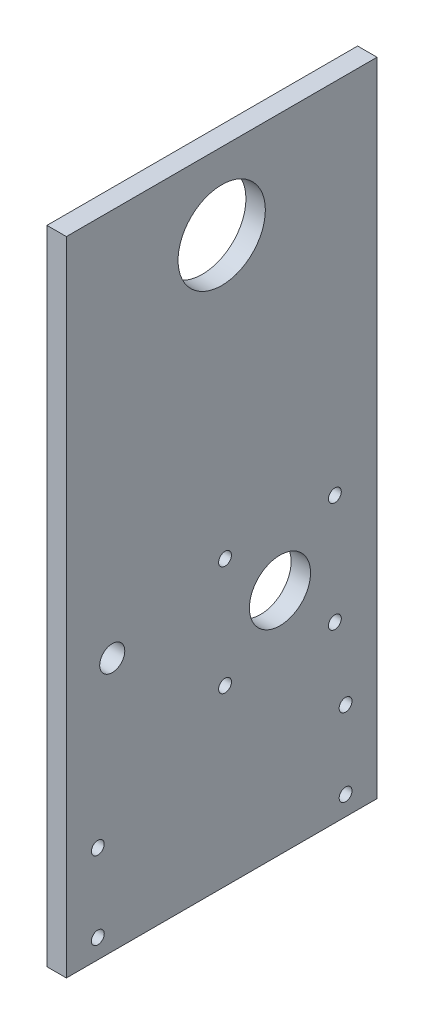
ISO-10303-21;
HEADER;
FILE_DESCRIPTION(('STEP AP214'),'2;1');
FILE_NAME('part.step','',(''),(''),'','','');
FILE_SCHEMA(('AUTOMOTIVE_DESIGN { 1 0 10303 214 1 1 1 1 }'));
ENDSEC;
DATA;
#1=APPLICATION_CONTEXT('core data for automotive mechanical design processes');
#2=APPLICATION_PROTOCOL_DEFINITION('international standard','automotive_design',2000,#1);
#3=PRODUCT_CONTEXT('',#1,'mechanical');
#4=PRODUCT('Part','Part','',(#3));
#5=PRODUCT_RELATED_PRODUCT_CATEGORY('part','',(#4));
#6=PRODUCT_DEFINITION_FORMATION('','',#4);
#7=PRODUCT_DEFINITION_CONTEXT('part definition',#1,'design');
#8=PRODUCT_DEFINITION('design','',#6,#7);
#9=PRODUCT_DEFINITION_SHAPE('','',#8);
#10=(LENGTH_UNIT() NAMED_UNIT(*) SI_UNIT(.MILLI.,.METRE.));
#11=(NAMED_UNIT(*) PLANE_ANGLE_UNIT() SI_UNIT($,.RADIAN.));
#12=(NAMED_UNIT(*) SI_UNIT($,.STERADIAN.) SOLID_ANGLE_UNIT());
#13=UNCERTAINTY_MEASURE_WITH_UNIT(LENGTH_MEASURE(1.E-05),#10,'distance_accuracy_value','');
#14=(GEOMETRIC_REPRESENTATION_CONTEXT(3) GLOBAL_UNCERTAINTY_ASSIGNED_CONTEXT((#13)) GLOBAL_UNIT_ASSIGNED_CONTEXT((#10,
#11,#12)) REPRESENTATION_CONTEXT('',''));
#15=CARTESIAN_POINT('',(0.,0.,0.));
#16=DIRECTION('',(0.,0.,1.));
#17=DIRECTION('',(1.,0.,0.));
#18=AXIS2_PLACEMENT_3D('',#15,#16,#17);
#19=CARTESIAN_POINT('',(6.35,0.,0.));
#20=DIRECTION('',(1.,0.,0.));
#21=DIRECTION('',(0.,0.,-1.));
#22=AXIS2_PLACEMENT_3D('',#19,#20,#21);
#23=PLANE('',#22);
#24=CARTESIAN_POINT('',(6.35,80.,0.));
#25=DIRECTION('',(1.,0.,0.));
#26=DIRECTION('',(0.,0.,-1.));
#27=AXIS2_PLACEMENT_3D('',#24,#25,#26);
#28=CIRCLE('',#27,14.275);
#29=CARTESIAN_POINT('',(6.35,80.,-14.275));
#30=VERTEX_POINT('',#29);
#31=EDGE_CURVE('E166',#30,#30,#28,.T.);
#32=ORIENTED_EDGE('',*,*,#31,.F.);
#33=EDGE_LOOP('',(#32));
#34=FACE_BOUND('',#33,.T.);
#35=CARTESIAN_POINT('',(6.35,-12.1894877578617,-1.08948775786164));
#36=DIRECTION('',(1.,0.,0.));
#37=DIRECTION('',(0.,0.,-1.));
#38=AXIS2_PLACEMENT_3D('',#35,#36,#37);
#39=CIRCLE('',#38,2.10000000000002);
#40=CARTESIAN_POINT('',(6.35,-12.1894877578617,-3.18948775786167));
#41=VERTEX_POINT('',#40);
#42=EDGE_CURVE('E154',#41,#41,#39,.T.);
#43=ORIENTED_EDGE('',*,*,#42,.F.);
#44=EDGE_LOOP('',(#43));
#45=FACE_BOUND('',#44,.T.);
#46=CARTESIAN_POINT('',(6.35,-12.1894877578616,-37.0105122421382));
#47=DIRECTION('',(1.,0.,0.));
#48=DIRECTION('',(0.,0.,-1.));
#49=AXIS2_PLACEMENT_3D('',#46,#47,#48);
#50=CIRCLE('',#49,2.10000000000002);
#51=CARTESIAN_POINT('',(6.35,-12.1894877578616,-39.1105122421382));
#52=VERTEX_POINT('',#51);
#53=EDGE_CURVE('E142',#52,#52,#50,.T.);
#54=ORIENTED_EDGE('',*,*,#53,.F.);
#55=EDGE_LOOP('',(#54));
#56=FACE_BOUND('',#55,.T.);
#57=CARTESIAN_POINT('',(6.35,-30.15,-19.05));
#58=DIRECTION('',(1.,0.,0.));
#59=DIRECTION('',(0.,0.,-1.));
#60=AXIS2_PLACEMENT_3D('',#57,#58,#59);
#61=CIRCLE('',#60,10.);
#62=CARTESIAN_POINT('',(6.35,-30.15,-29.05));
#63=VERTEX_POINT('',#62);
#64=EDGE_CURVE('E130',#63,#63,#61,.T.);
#65=ORIENTED_EDGE('',*,*,#64,.F.);
#66=EDGE_LOOP('',(#65));
#67=FACE_BOUND('',#66,.T.);
#68=CARTESIAN_POINT('',(6.35,-73.25,40.513));
#69=DIRECTION('',(1.,0.,0.));
#70=DIRECTION('',(0.,0.,-1.));
#71=AXIS2_PLACEMENT_3D('',#68,#69,#70);
#72=CIRCLE('',#71,2.1);
#73=CARTESIAN_POINT('',(6.35,-73.25,38.413));
#74=VERTEX_POINT('',#73);
#75=EDGE_CURVE('E118',#74,#74,#72,.T.);
#76=ORIENTED_EDGE('',*,*,#75,.F.);
#77=EDGE_LOOP('',(#76));
#78=FACE_BOUND('',#77,.T.);
#79=DIRECTION('',(0.,1.,0.));
#80=VECTOR('',#79,1.);
#81=CARTESIAN_POINT('',(6.35,105.,-50.8));
#82=LINE('',#81,#80);
#83=CARTESIAN_POINT('',(6.35,-105.,-50.8));
#84=VERTEX_POINT('',#83);
#85=CARTESIAN_POINT('',(6.35,105.,-50.8));
#86=VERTEX_POINT('',#85);
#87=EDGE_CURVE('E88',#84,#86,#82,.T.);
#88=ORIENTED_EDGE('',*,*,#87,.T.);
#89=DIRECTION('',(0.,0.,1.));
#90=VECTOR('',#89,1.);
#91=CARTESIAN_POINT('',(6.35,105.,50.8));
#92=LINE('',#91,#90);
#93=CARTESIAN_POINT('',(6.35,105.,50.8));
#94=VERTEX_POINT('',#93);
#95=EDGE_CURVE('E83',#86,#94,#92,.T.);
#96=ORIENTED_EDGE('',*,*,#95,.T.);
#97=DIRECTION('',(0.,-1.,0.));
#98=VECTOR('',#97,1.);
#99=CARTESIAN_POINT('',(6.35,105.,50.8));
#100=LINE('',#99,#98);
#101=CARTESIAN_POINT('',(6.35,-105.,50.8));
#102=VERTEX_POINT('',#101);
#103=EDGE_CURVE('E86',#94,#102,#100,.T.);
#104=ORIENTED_EDGE('',*,*,#103,.T.);
#105=DIRECTION('',(0.,0.,-1.));
#106=VECTOR('',#105,1.);
#107=CARTESIAN_POINT('',(6.35,-105.,50.8));
#108=LINE('',#107,#106);
#109=EDGE_CURVE('E53',#102,#84,#108,.T.);
#110=ORIENTED_EDGE('',*,*,#109,.T.);
#111=EDGE_LOOP('',(#88,#96,#104,#110));
#112=FACE_BOUND('',#111,.T.);
#113=CARTESIAN_POINT('',(6.35,-98.65,40.513));
#114=DIRECTION('',(1.,0.,0.));
#115=DIRECTION('',(0.,0.,-1.));
#116=AXIS2_PLACEMENT_3D('',#113,#114,#115);
#117=CIRCLE('',#116,2.1);
#118=CARTESIAN_POINT('',(6.35,-98.65,38.413));
#119=VERTEX_POINT('',#118);
#120=EDGE_CURVE('E103',#119,#119,#117,.T.);
#121=ORIENTED_EDGE('',*,*,#120,.F.);
#122=EDGE_LOOP('',(#121));
#123=FACE_BOUND('',#122,.T.);
#124=CARTESIAN_POINT('',(6.35,-98.65,-40.513));
#125=DIRECTION('',(1.,0.,0.));
#126=DIRECTION('',(0.,0.,-1.));
#127=AXIS2_PLACEMENT_3D('',#124,#125,#126);
#128=CIRCLE('',#127,2.1);
#129=CARTESIAN_POINT('',(6.35,-98.65,-42.613));
#130=VERTEX_POINT('',#129);
#131=EDGE_CURVE('E124',#130,#130,#128,.T.);
#132=ORIENTED_EDGE('',*,*,#131,.F.);
#133=EDGE_LOOP('',(#132));
#134=FACE_BOUND('',#133,.T.);
#135=CARTESIAN_POINT('',(6.35,-48.1105122421384,-1.08948775786179));
#136=DIRECTION('',(1.,0.,0.));
#137=DIRECTION('',(0.,0.,-1.));
#138=AXIS2_PLACEMENT_3D('',#135,#136,#137);
#139=CIRCLE('',#138,2.10000000000001);
#140=CARTESIAN_POINT('',(6.35,-48.1105122421384,-3.18948775786179));
#141=VERTEX_POINT('',#140);
#142=EDGE_CURVE('E136',#141,#141,#139,.T.);
#143=ORIENTED_EDGE('',*,*,#142,.F.);
#144=EDGE_LOOP('',(#143));
#145=FACE_BOUND('',#144,.T.);
#146=CARTESIAN_POINT('',(6.35,-48.1105122421383,-37.0105122421383));
#147=DIRECTION('',(1.,0.,0.));
#148=DIRECTION('',(0.,0.,-1.));
#149=AXIS2_PLACEMENT_3D('',#146,#147,#148);
#150=CIRCLE('',#149,2.09999999999999);
#151=CARTESIAN_POINT('',(6.35,-48.1105122421383,-39.1105122421383));
#152=VERTEX_POINT('',#151);
#153=EDGE_CURVE('E148',#152,#152,#150,.T.);
#154=ORIENTED_EDGE('',*,*,#153,.F.);
#155=EDGE_LOOP('',(#154));
#156=FACE_BOUND('',#155,.T.);
#157=CARTESIAN_POINT('',(6.35,-21.9,35.8));
#158=DIRECTION('',(1.,0.,0.));
#159=DIRECTION('',(0.,0.,-1.));
#160=AXIS2_PLACEMENT_3D('',#157,#158,#159);
#161=CIRCLE('',#160,4.1);
#162=CARTESIAN_POINT('',(6.35,-21.9,31.7));
#163=VERTEX_POINT('',#162);
#164=EDGE_CURVE('E160',#163,#163,#161,.T.);
#165=ORIENTED_EDGE('',*,*,#164,.F.);
#166=EDGE_LOOP('',(#165));
#167=FACE_BOUND('',#166,.T.);
#168=CARTESIAN_POINT('',(6.35,-73.25,-40.513));
#169=DIRECTION('',(1.,0.,0.));
#170=DIRECTION('',(0.,0.,-1.));
#171=AXIS2_PLACEMENT_3D('',#168,#169,#170);
#172=CIRCLE('',#171,2.1);
#173=CARTESIAN_POINT('',(6.35,-73.25,-42.613));
#174=VERTEX_POINT('',#173);
#175=EDGE_CURVE('E172',#174,#174,#172,.T.);
#176=ORIENTED_EDGE('',*,*,#175,.F.);
#177=EDGE_LOOP('',(#176));
#178=FACE_BOUND('',#177,.T.);
#179=ADVANCED_FACE('F36',(#34,#45,#56,#67,#78,#112,#123,#134,#145,#156,#167,#178),#23,.T.);
#180=CARTESIAN_POINT('',(0.,0.,0.));
#181=DIRECTION('',(1.,0.,0.));
#182=DIRECTION('',(0.,0.,-1.));
#183=AXIS2_PLACEMENT_3D('',#180,#181,#182);
#184=PLANE('',#183);
#185=DIRECTION('',(0.,1.,0.));
#186=VECTOR('',#185,1.);
#187=CARTESIAN_POINT('',(0.,105.,-50.8));
#188=LINE('',#187,#186);
#189=CARTESIAN_POINT('',(0.,-105.,-50.8));
#190=VERTEX_POINT('',#189);
#191=CARTESIAN_POINT('',(0.,105.,-50.8));
#192=VERTEX_POINT('',#191);
#193=EDGE_CURVE('E100',#190,#192,#188,.T.);
#194=ORIENTED_EDGE('',*,*,#193,.F.);
#195=DIRECTION('',(0.,0.,-1.));
#196=VECTOR('',#195,1.);
#197=CARTESIAN_POINT('',(0.,-105.,50.8));
#198=LINE('',#197,#196);
#199=CARTESIAN_POINT('',(0.,-105.,50.8));
#200=VERTEX_POINT('',#199);
#201=EDGE_CURVE('E76',#200,#190,#198,.T.);
#202=ORIENTED_EDGE('',*,*,#201,.F.);
#203=DIRECTION('',(0.,-1.,0.));
#204=VECTOR('',#203,1.);
#205=CARTESIAN_POINT('',(0.,105.,50.8));
#206=LINE('',#205,#204);
#207=CARTESIAN_POINT('',(0.,105.,50.8));
#208=VERTEX_POINT('',#207);
#209=EDGE_CURVE('E70',#208,#200,#206,.T.);
#210=ORIENTED_EDGE('',*,*,#209,.F.);
#211=DIRECTION('',(0.,0.,1.));
#212=VECTOR('',#211,1.);
#213=CARTESIAN_POINT('',(0.,105.,50.8));
#214=LINE('',#213,#212);
#215=EDGE_CURVE('E92',#192,#208,#214,.T.);
#216=ORIENTED_EDGE('',*,*,#215,.F.);
#217=EDGE_LOOP('',(#194,#202,#210,#216));
#218=FACE_BOUND('',#217,.T.);
#219=CARTESIAN_POINT('',(0.,-98.65,40.513));
#220=DIRECTION('',(1.,0.,0.));
#221=DIRECTION('',(0.,0.,-1.));
#222=AXIS2_PLACEMENT_3D('',#219,#220,#221);
#223=CIRCLE('',#222,2.1);
#224=CARTESIAN_POINT('',(0.,-98.65,38.413));
#225=VERTEX_POINT('',#224);
#226=EDGE_CURVE('E115',#225,#225,#223,.T.);
#227=ORIENTED_EDGE('',*,*,#226,.T.);
#228=EDGE_LOOP('',(#227));
#229=FACE_BOUND('',#228,.T.);
#230=CARTESIAN_POINT('',(0.,-73.25,40.513));
#231=DIRECTION('',(1.,0.,0.));
#232=DIRECTION('',(0.,0.,-1.));
#233=AXIS2_PLACEMENT_3D('',#230,#231,#232);
#234=CIRCLE('',#233,2.1);
#235=CARTESIAN_POINT('',(0.,-73.25,38.413));
#236=VERTEX_POINT('',#235);
#237=EDGE_CURVE('E121',#236,#236,#234,.T.);
#238=ORIENTED_EDGE('',*,*,#237,.T.);
#239=EDGE_LOOP('',(#238));
#240=FACE_BOUND('',#239,.T.);
#241=CARTESIAN_POINT('',(0.,-98.65,-40.513));
#242=DIRECTION('',(1.,0.,0.));
#243=DIRECTION('',(0.,0.,-1.));
#244=AXIS2_PLACEMENT_3D('',#241,#242,#243);
#245=CIRCLE('',#244,2.1);
#246=CARTESIAN_POINT('',(0.,-98.65,-42.613));
#247=VERTEX_POINT('',#246);
#248=EDGE_CURVE('E127',#247,#247,#245,.T.);
#249=ORIENTED_EDGE('',*,*,#248,.T.);
#250=EDGE_LOOP('',(#249));
#251=FACE_BOUND('',#250,.T.);
#252=CARTESIAN_POINT('',(0.,-30.15,-19.05));
#253=DIRECTION('',(1.,0.,0.));
#254=DIRECTION('',(0.,0.,-1.));
#255=AXIS2_PLACEMENT_3D('',#252,#253,#254);
#256=CIRCLE('',#255,10.);
#257=CARTESIAN_POINT('',(0.,-30.15,-29.05));
#258=VERTEX_POINT('',#257);
#259=EDGE_CURVE('E133',#258,#258,#256,.T.);
#260=ORIENTED_EDGE('',*,*,#259,.T.);
#261=EDGE_LOOP('',(#260));
#262=FACE_BOUND('',#261,.T.);
#263=CARTESIAN_POINT('',(0.,-48.1105122421384,-1.08948775786179));
#264=DIRECTION('',(1.,0.,0.));
#265=DIRECTION('',(0.,0.,-1.));
#266=AXIS2_PLACEMENT_3D('',#263,#264,#265);
#267=CIRCLE('',#266,2.10000000000001);
#268=CARTESIAN_POINT('',(0.,-48.1105122421384,-3.18948775786179));
#269=VERTEX_POINT('',#268);
#270=EDGE_CURVE('E139',#269,#269,#267,.T.);
#271=ORIENTED_EDGE('',*,*,#270,.T.);
#272=EDGE_LOOP('',(#271));
#273=FACE_BOUND('',#272,.T.);
#274=CARTESIAN_POINT('',(0.,-12.1894877578616,-37.0105122421382));
#275=DIRECTION('',(1.,0.,0.));
#276=DIRECTION('',(0.,0.,-1.));
#277=AXIS2_PLACEMENT_3D('',#274,#275,#276);
#278=CIRCLE('',#277,2.10000000000002);
#279=CARTESIAN_POINT('',(0.,-12.1894877578616,-39.1105122421382));
#280=VERTEX_POINT('',#279);
#281=EDGE_CURVE('E145',#280,#280,#278,.T.);
#282=ORIENTED_EDGE('',*,*,#281,.T.);
#283=EDGE_LOOP('',(#282));
#284=FACE_BOUND('',#283,.T.);
#285=CARTESIAN_POINT('',(0.,-48.1105122421383,-37.0105122421383));
#286=DIRECTION('',(1.,0.,0.));
#287=DIRECTION('',(0.,0.,-1.));
#288=AXIS2_PLACEMENT_3D('',#285,#286,#287);
#289=CIRCLE('',#288,2.09999999999999);
#290=CARTESIAN_POINT('',(0.,-48.1105122421383,-39.1105122421383));
#291=VERTEX_POINT('',#290);
#292=EDGE_CURVE('E151',#291,#291,#289,.T.);
#293=ORIENTED_EDGE('',*,*,#292,.T.);
#294=EDGE_LOOP('',(#293));
#295=FACE_BOUND('',#294,.T.);
#296=CARTESIAN_POINT('',(0.,-12.1894877578617,-1.08948775786164));
#297=DIRECTION('',(1.,0.,0.));
#298=DIRECTION('',(0.,0.,-1.));
#299=AXIS2_PLACEMENT_3D('',#296,#297,#298);
#300=CIRCLE('',#299,2.10000000000002);
#301=CARTESIAN_POINT('',(0.,-12.1894877578617,-3.18948775786167));
#302=VERTEX_POINT('',#301);
#303=EDGE_CURVE('E157',#302,#302,#300,.T.);
#304=ORIENTED_EDGE('',*,*,#303,.T.);
#305=EDGE_LOOP('',(#304));
#306=FACE_BOUND('',#305,.T.);
#307=CARTESIAN_POINT('',(0.,-21.9,35.8));
#308=DIRECTION('',(1.,0.,0.));
#309=DIRECTION('',(0.,0.,-1.));
#310=AXIS2_PLACEMENT_3D('',#307,#308,#309);
#311=CIRCLE('',#310,4.1);
#312=CARTESIAN_POINT('',(0.,-21.9,31.7));
#313=VERTEX_POINT('',#312);
#314=EDGE_CURVE('E163',#313,#313,#311,.T.);
#315=ORIENTED_EDGE('',*,*,#314,.T.);
#316=EDGE_LOOP('',(#315));
#317=FACE_BOUND('',#316,.T.);
#318=CARTESIAN_POINT('',(0.,80.,0.));
#319=DIRECTION('',(1.,0.,0.));
#320=DIRECTION('',(0.,0.,-1.));
#321=AXIS2_PLACEMENT_3D('',#318,#319,#320);
#322=CIRCLE('',#321,14.275);
#323=CARTESIAN_POINT('',(0.,80.,-14.275));
#324=VERTEX_POINT('',#323);
#325=EDGE_CURVE('E169',#324,#324,#322,.T.);
#326=ORIENTED_EDGE('',*,*,#325,.T.);
#327=EDGE_LOOP('',(#326));
#328=FACE_BOUND('',#327,.T.);
#329=CARTESIAN_POINT('',(0.,-73.25,-40.513));
#330=DIRECTION('',(1.,0.,0.));
#331=DIRECTION('',(0.,0.,-1.));
#332=AXIS2_PLACEMENT_3D('',#329,#330,#331);
#333=CIRCLE('',#332,2.1);
#334=CARTESIAN_POINT('',(0.,-73.25,-42.613));
#335=VERTEX_POINT('',#334);
#336=EDGE_CURVE('E175',#335,#335,#333,.T.);
#337=ORIENTED_EDGE('',*,*,#336,.T.);
#338=EDGE_LOOP('',(#337));
#339=FACE_BOUND('',#338,.T.);
#340=ADVANCED_FACE('F111',(#218,#229,#240,#251,#262,#273,#284,#295,#306,#317,#328,#339),#184,.F.);
#341=CARTESIAN_POINT('',(6.35,105.,-50.8));
#342=DIRECTION('',(0.,0.,1.));
#343=DIRECTION('',(0.,-1.,0.));
#344=AXIS2_PLACEMENT_3D('',#341,#342,#343);
#345=PLANE('',#344);
#346=ORIENTED_EDGE('',*,*,#193,.T.);
#347=DIRECTION('',(-1.,0.,0.));
#348=VECTOR('',#347,1.);
#349=CARTESIAN_POINT('',(6.35,105.,-50.8));
#350=LINE('',#349,#348);
#351=EDGE_CURVE('E11',#86,#192,#350,.T.);
#352=ORIENTED_EDGE('',*,*,#351,.F.);
#353=ORIENTED_EDGE('',*,*,#87,.F.);
#354=DIRECTION('',(-1.,0.,0.));
#355=VECTOR('',#354,1.);
#356=CARTESIAN_POINT('',(6.35,-105.,-50.8));
#357=LINE('',#356,#355);
#358=EDGE_CURVE('E96',#84,#190,#357,.T.);
#359=ORIENTED_EDGE('',*,*,#358,.T.);
#360=EDGE_LOOP('',(#346,#352,#353,#359));
#361=FACE_BOUND('',#360,.T.);
#362=ADVANCED_FACE('F38',(#361),#345,.F.);
#363=CARTESIAN_POINT('',(6.35,105.,50.8));
#364=DIRECTION('',(0.,-1.,0.));
#365=DIRECTION('',(0.,0.,-1.));
#366=AXIS2_PLACEMENT_3D('',#363,#364,#365);
#367=PLANE('',#366);
#368=ORIENTED_EDGE('',*,*,#215,.T.);
#369=DIRECTION('',(-1.,0.,0.));
#370=VECTOR('',#369,1.);
#371=CARTESIAN_POINT('',(6.35,105.,50.8));
#372=LINE('',#371,#370);
#373=EDGE_CURVE('E45',#94,#208,#372,.T.);
#374=ORIENTED_EDGE('',*,*,#373,.F.);
#375=ORIENTED_EDGE('',*,*,#95,.F.);
#376=ORIENTED_EDGE('',*,*,#351,.T.);
#377=EDGE_LOOP('',(#368,#374,#375,#376));
#378=FACE_BOUND('',#377,.T.);
#379=ADVANCED_FACE('F91',(#378),#367,.F.);
#380=CARTESIAN_POINT('',(6.35,105.,50.8));
#381=DIRECTION('',(0.,0.,-1.));
#382=DIRECTION('',(0.,1.,0.));
#383=AXIS2_PLACEMENT_3D('',#380,#381,#382);
#384=PLANE('',#383);
#385=ORIENTED_EDGE('',*,*,#209,.T.);
#386=DIRECTION('',(-1.,0.,0.));
#387=VECTOR('',#386,1.);
#388=CARTESIAN_POINT('',(6.35,-105.,50.8));
#389=LINE('',#388,#387);
#390=EDGE_CURVE('E93',#102,#200,#389,.T.);
#391=ORIENTED_EDGE('',*,*,#390,.F.);
#392=ORIENTED_EDGE('',*,*,#103,.F.);
#393=ORIENTED_EDGE('',*,*,#373,.T.);
#394=EDGE_LOOP('',(#385,#391,#392,#393));
#395=FACE_BOUND('',#394,.T.);
#396=ADVANCED_FACE('F94',(#395),#384,.F.);
#397=CARTESIAN_POINT('',(6.35,-105.,50.8));
#398=DIRECTION('',(0.,1.,0.));
#399=DIRECTION('',(0.,0.,1.));
#400=AXIS2_PLACEMENT_3D('',#397,#398,#399);
#401=PLANE('',#400);
#402=ORIENTED_EDGE('',*,*,#201,.T.);
#403=ORIENTED_EDGE('',*,*,#358,.F.);
#404=ORIENTED_EDGE('',*,*,#109,.F.);
#405=ORIENTED_EDGE('',*,*,#390,.T.);
#406=EDGE_LOOP('',(#402,#403,#404,#405));
#407=FACE_BOUND('',#406,.T.);
#408=ADVANCED_FACE('F108',(#407),#401,.F.);
#409=CARTESIAN_POINT('',(6.35,-98.65,40.513));
#410=DIRECTION('',(-1.,0.,0.));
#411=DIRECTION('',(0.,0.,1.));
#412=AXIS2_PLACEMENT_3D('',#409,#410,#411);
#413=CYLINDRICAL_SURFACE('',#412,2.1);
#414=ORIENTED_EDGE('',*,*,#120,.T.);
#415=EDGE_LOOP('',(#414));
#416=FACE_BOUND('',#415,.T.);
#417=ORIENTED_EDGE('',*,*,#226,.F.);
#418=EDGE_LOOP('',(#417));
#419=FACE_BOUND('',#418,.T.);
#420=ADVANCED_FACE('F194',(#416,#419),#413,.F.);
#421=CARTESIAN_POINT('',(6.35,-73.25,40.513));
#422=DIRECTION('',(-1.,0.,0.));
#423=DIRECTION('',(0.,0.,1.));
#424=AXIS2_PLACEMENT_3D('',#421,#422,#423);
#425=CYLINDRICAL_SURFACE('',#424,2.1);
#426=ORIENTED_EDGE('',*,*,#75,.T.);
#427=EDGE_LOOP('',(#426));
#428=FACE_BOUND('',#427,.T.);
#429=ORIENTED_EDGE('',*,*,#237,.F.);
#430=EDGE_LOOP('',(#429));
#431=FACE_BOUND('',#430,.T.);
#432=ADVANCED_FACE('F240',(#428,#431),#425,.F.);
#433=CARTESIAN_POINT('',(6.35,-98.65,-40.513));
#434=DIRECTION('',(-1.,0.,0.));
#435=DIRECTION('',(0.,0.,1.));
#436=AXIS2_PLACEMENT_3D('',#433,#434,#435);
#437=CYLINDRICAL_SURFACE('',#436,2.1);
#438=ORIENTED_EDGE('',*,*,#131,.T.);
#439=EDGE_LOOP('',(#438));
#440=FACE_BOUND('',#439,.T.);
#441=ORIENTED_EDGE('',*,*,#248,.F.);
#442=EDGE_LOOP('',(#441));
#443=FACE_BOUND('',#442,.T.);
#444=ADVANCED_FACE('F248',(#440,#443),#437,.F.);
#445=CARTESIAN_POINT('',(6.35,-30.15,-19.05));
#446=DIRECTION('',(-1.,0.,0.));
#447=DIRECTION('',(0.,0.,1.));
#448=AXIS2_PLACEMENT_3D('',#445,#446,#447);
#449=CYLINDRICAL_SURFACE('',#448,10.);
#450=ORIENTED_EDGE('',*,*,#64,.T.);
#451=EDGE_LOOP('',(#450));
#452=FACE_BOUND('',#451,.T.);
#453=ORIENTED_EDGE('',*,*,#259,.F.);
#454=EDGE_LOOP('',(#453));
#455=FACE_BOUND('',#454,.T.);
#456=ADVANCED_FACE('F256',(#452,#455),#449,.F.);
#457=CARTESIAN_POINT('',(6.35,-48.1105122421384,-1.08948775786179));
#458=DIRECTION('',(-1.,0.,0.));
#459=DIRECTION('',(0.,0.,1.));
#460=AXIS2_PLACEMENT_3D('',#457,#458,#459);
#461=CYLINDRICAL_SURFACE('',#460,2.10000000000001);
#462=ORIENTED_EDGE('',*,*,#142,.T.);
#463=EDGE_LOOP('',(#462));
#464=FACE_BOUND('',#463,.T.);
#465=ORIENTED_EDGE('',*,*,#270,.F.);
#466=EDGE_LOOP('',(#465));
#467=FACE_BOUND('',#466,.T.);
#468=ADVANCED_FACE('F265',(#464,#467),#461,.F.);
#469=CARTESIAN_POINT('',(6.35,-12.1894877578616,-37.0105122421382));
#470=DIRECTION('',(-1.,0.,0.));
#471=DIRECTION('',(0.,0.,1.));
#472=AXIS2_PLACEMENT_3D('',#469,#470,#471);
#473=CYLINDRICAL_SURFACE('',#472,2.10000000000002);
#474=ORIENTED_EDGE('',*,*,#53,.T.);
#475=EDGE_LOOP('',(#474));
#476=FACE_BOUND('',#475,.T.);
#477=ORIENTED_EDGE('',*,*,#281,.F.);
#478=EDGE_LOOP('',(#477));
#479=FACE_BOUND('',#478,.T.);
#480=ADVANCED_FACE('F274',(#476,#479),#473,.F.);
#481=CARTESIAN_POINT('',(6.35,-48.1105122421383,-37.0105122421383));
#482=DIRECTION('',(-1.,0.,0.));
#483=DIRECTION('',(0.,0.,1.));
#484=AXIS2_PLACEMENT_3D('',#481,#482,#483);
#485=CYLINDRICAL_SURFACE('',#484,2.09999999999999);
#486=ORIENTED_EDGE('',*,*,#153,.T.);
#487=EDGE_LOOP('',(#486));
#488=FACE_BOUND('',#487,.T.);
#489=ORIENTED_EDGE('',*,*,#292,.F.);
#490=EDGE_LOOP('',(#489));
#491=FACE_BOUND('',#490,.T.);
#492=ADVANCED_FACE('F283',(#488,#491),#485,.F.);
#493=CARTESIAN_POINT('',(6.35,-12.1894877578617,-1.08948775786164));
#494=DIRECTION('',(-1.,0.,0.));
#495=DIRECTION('',(0.,0.,1.));
#496=AXIS2_PLACEMENT_3D('',#493,#494,#495);
#497=CYLINDRICAL_SURFACE('',#496,2.10000000000002);
#498=ORIENTED_EDGE('',*,*,#42,.T.);
#499=EDGE_LOOP('',(#498));
#500=FACE_BOUND('',#499,.T.);
#501=ORIENTED_EDGE('',*,*,#303,.F.);
#502=EDGE_LOOP('',(#501));
#503=FACE_BOUND('',#502,.T.);
#504=ADVANCED_FACE('F292',(#500,#503),#497,.F.);
#505=CARTESIAN_POINT('',(6.35,-21.9,35.8));
#506=DIRECTION('',(-1.,0.,0.));
#507=DIRECTION('',(0.,0.,1.));
#508=AXIS2_PLACEMENT_3D('',#505,#506,#507);
#509=CYLINDRICAL_SURFACE('',#508,4.1);
#510=ORIENTED_EDGE('',*,*,#164,.T.);
#511=EDGE_LOOP('',(#510));
#512=FACE_BOUND('',#511,.T.);
#513=ORIENTED_EDGE('',*,*,#314,.F.);
#514=EDGE_LOOP('',(#513));
#515=FACE_BOUND('',#514,.T.);
#516=ADVANCED_FACE('F301',(#512,#515),#509,.F.);
#517=CARTESIAN_POINT('',(6.35,80.,0.));
#518=DIRECTION('',(-1.,0.,0.));
#519=DIRECTION('',(0.,0.,1.));
#520=AXIS2_PLACEMENT_3D('',#517,#518,#519);
#521=CYLINDRICAL_SURFACE('',#520,14.275);
#522=ORIENTED_EDGE('',*,*,#31,.T.);
#523=EDGE_LOOP('',(#522));
#524=FACE_BOUND('',#523,.T.);
#525=ORIENTED_EDGE('',*,*,#325,.F.);
#526=EDGE_LOOP('',(#525));
#527=FACE_BOUND('',#526,.T.);
#528=ADVANCED_FACE('F310',(#524,#527),#521,.F.);
#529=CARTESIAN_POINT('',(6.35,-73.25,-40.513));
#530=DIRECTION('',(-1.,0.,0.));
#531=DIRECTION('',(0.,0.,1.));
#532=AXIS2_PLACEMENT_3D('',#529,#530,#531);
#533=CYLINDRICAL_SURFACE('',#532,2.1);
#534=ORIENTED_EDGE('',*,*,#175,.T.);
#535=EDGE_LOOP('',(#534));
#536=FACE_BOUND('',#535,.T.);
#537=ORIENTED_EDGE('',*,*,#336,.F.);
#538=EDGE_LOOP('',(#537));
#539=FACE_BOUND('',#538,.T.);
#540=ADVANCED_FACE('F181',(#536,#539),#533,.F.);
#541=CLOSED_SHELL('',(#179,#340,#362,#379,#396,#408,#420,#432,#444,#456,#468,#480,#492,#504,
#516,#528,#540));
#542=MANIFOLD_SOLID_BREP('B2',#541);
#543=ADVANCED_BREP_SHAPE_REPRESENTATION('',(#18,#542),#14);
#544=SHAPE_DEFINITION_REPRESENTATION(#9,#543);
ENDSEC;
END-ISO-10303-21;
